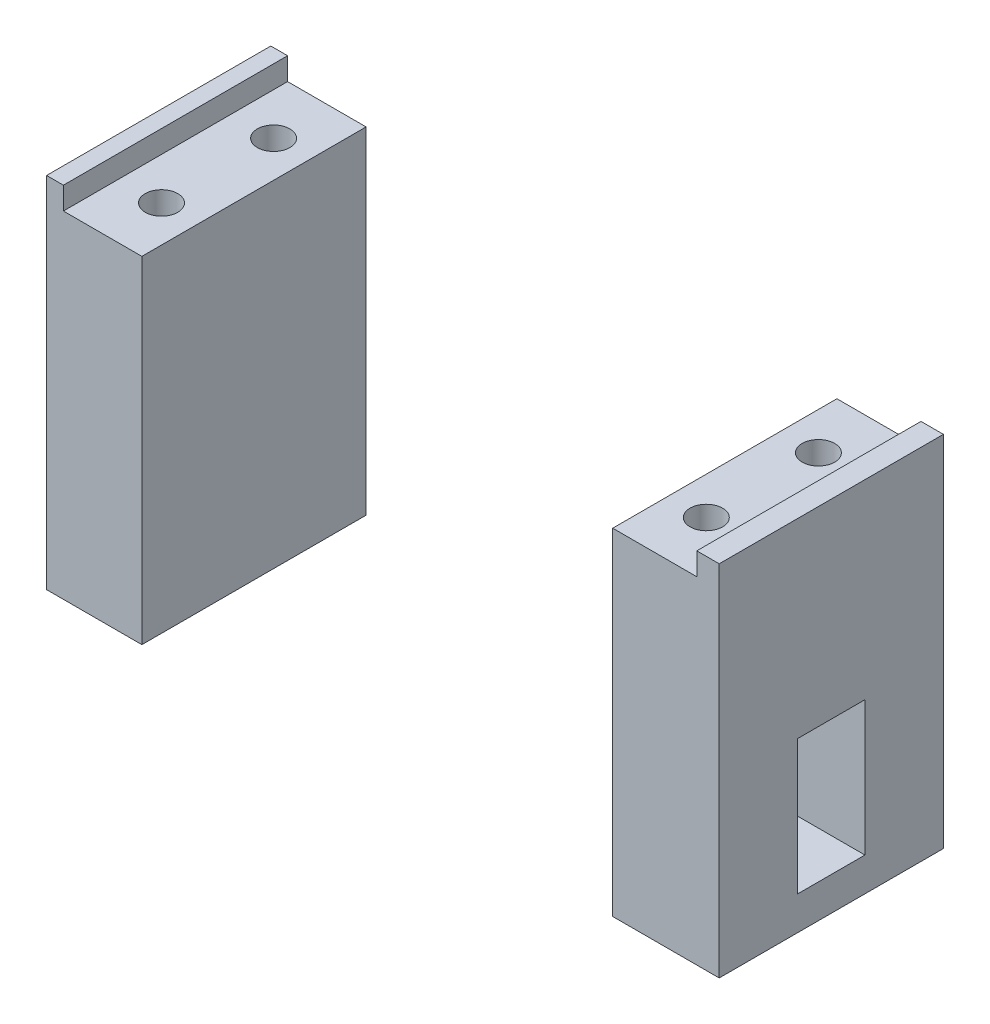
ISO-10303-21;
HEADER;
FILE_DESCRIPTION(('STEP AP214'),'2;1');
FILE_NAME('part.step','',(''),(''),'','','');
FILE_SCHEMA(('AUTOMOTIVE_DESIGN { 1 0 10303 214 1 1 1 1 }'));
ENDSEC;
DATA;
#1=APPLICATION_CONTEXT('core data for automotive mechanical design processes');
#2=APPLICATION_PROTOCOL_DEFINITION('international standard','automotive_design',2000,#1);
#3=PRODUCT_CONTEXT('',#1,'mechanical');
#4=PRODUCT('Part','Part','',(#3));
#5=PRODUCT_RELATED_PRODUCT_CATEGORY('part','',(#4));
#6=PRODUCT_DEFINITION_FORMATION('','',#4);
#7=PRODUCT_DEFINITION_CONTEXT('part definition',#1,'design');
#8=PRODUCT_DEFINITION('design','',#6,#7);
#9=PRODUCT_DEFINITION_SHAPE('','',#8);
#10=(LENGTH_UNIT() NAMED_UNIT(*) SI_UNIT(.MILLI.,.METRE.));
#11=(NAMED_UNIT(*) PLANE_ANGLE_UNIT() SI_UNIT($,.RADIAN.));
#12=(NAMED_UNIT(*) SI_UNIT($,.STERADIAN.) SOLID_ANGLE_UNIT());
#13=UNCERTAINTY_MEASURE_WITH_UNIT(LENGTH_MEASURE(1.E-05),#10,'distance_accuracy_value','');
#14=(GEOMETRIC_REPRESENTATION_CONTEXT(3) GLOBAL_UNCERTAINTY_ASSIGNED_CONTEXT((#13)) GLOBAL_UNIT_ASSIGNED_CONTEXT((#10,
#11,#12)) REPRESENTATION_CONTEXT('',''));
#15=CARTESIAN_POINT('',(0.,0.,0.));
#16=DIRECTION('',(0.,0.,1.));
#17=DIRECTION('',(1.,0.,0.));
#18=AXIS2_PLACEMENT_3D('',#15,#16,#17);
#19=CARTESIAN_POINT('',(0.,30.,0.));
#20=DIRECTION('',(0.,-1.,0.));
#21=DIRECTION('',(0.,0.,-1.));
#22=AXIS2_PLACEMENT_3D('',#19,#20,#21);
#23=PLANE('',#22);
#24=CARTESIAN_POINT('',(13.85,30.,-5.));
#25=DIRECTION('',(0.,1.,0.));
#26=DIRECTION('',(0.,0.,1.));
#27=AXIS2_PLACEMENT_3D('',#24,#25,#26);
#28=CIRCLE('',#27,1.45);
#29=CARTESIAN_POINT('',(13.85,30.,-3.55));
#30=VERTEX_POINT('',#29);
#31=EDGE_CURVE('E180',#30,#30,#28,.T.);
#32=ORIENTED_EDGE('',*,*,#31,.F.);
#33=EDGE_LOOP('',(#32));
#34=FACE_BOUND('',#33,.T.);
#35=CARTESIAN_POINT('',(13.85,30.,5.));
#36=DIRECTION('',(0.,1.,0.));
#37=DIRECTION('',(0.,0.,1.));
#38=AXIS2_PLACEMENT_3D('',#35,#36,#37);
#39=CIRCLE('',#38,1.45);
#40=CARTESIAN_POINT('',(13.85,30.,6.45));
#41=VERTEX_POINT('',#40);
#42=EDGE_CURVE('E190',#41,#41,#39,.T.);
#43=ORIENTED_EDGE('',*,*,#42,.F.);
#44=EDGE_LOOP('',(#43));
#45=FACE_BOUND('',#44,.T.);
#46=DIRECTION('',(0.,0.,1.));
#47=VECTOR('',#46,1.);
#48=CARTESIAN_POINT('',(17.9999999999818,30.,-9.99999999999091));
#49=LINE('',#48,#47);
#50=CARTESIAN_POINT('',(17.9999999999723,30.,-9.99999999999091));
#51=VERTEX_POINT('',#50);
#52=CARTESIAN_POINT('',(17.9999999999818,30.,9.99999999998241));
#53=VERTEX_POINT('',#52);
#54=EDGE_CURVE('E198',#51,#53,#49,.T.);
#55=ORIENTED_EDGE('',*,*,#54,.F.);
#56=DIRECTION('',(1.,0.,0.));
#57=VECTOR('',#56,1.);
#58=CARTESIAN_POINT('',(-400010.,30.,-9.99999999999091));
#59=LINE('',#58,#57);
#60=CARTESIAN_POINT('',(10.4999999999791,30.,-9.99999999999091));
#61=VERTEX_POINT('',#60);
#62=EDGE_CURVE('E248',#61,#51,#59,.T.);
#63=ORIENTED_EDGE('',*,*,#62,.F.);
#64=DIRECTION('',(0.,0.,-1.));
#65=VECTOR('',#64,1.);
#66=CARTESIAN_POINT('',(10.4999999999791,30.,291589.));
#67=LINE('',#66,#65);
#68=CARTESIAN_POINT('',(10.4999999999791,30.,9.99999999998239));
#69=VERTEX_POINT('',#68);
#70=EDGE_CURVE('E233',#69,#61,#67,.T.);
#71=ORIENTED_EDGE('',*,*,#70,.F.);
#72=DIRECTION('',(-1.,0.,0.));
#73=VECTOR('',#72,1.);
#74=CARTESIAN_POINT('',(-400009.999999999,30.,9.99999999925194));
#75=LINE('',#74,#73);
#76=EDGE_CURVE('E224',#53,#69,#75,.T.);
#77=ORIENTED_EDGE('',*,*,#76,.F.);
#78=EDGE_LOOP('',(#55,#63,#71,#77));
#79=FACE_BOUND('',#78,.T.);
#80=ADVANCED_FACE('F59',(#34,#45,#79),#23,.F.);
#81=CARTESIAN_POINT('',(10.4999999999791,30.,291589.));
#82=DIRECTION('',(-1.,0.,0.));
#83=DIRECTION('',(0.,0.,1.));
#84=AXIS2_PLACEMENT_3D('',#81,#82,#83);
#85=PLANE('',#84);
#86=DIRECTION('',(0.,1.,0.));
#87=VECTOR('',#86,1.);
#88=CARTESIAN_POINT('',(10.4999999999791,15.,-4.50000000000728));
#89=LINE('',#88,#87);
#90=CARTESIAN_POINT('',(10.4999999999791,3.,-4.50000000000728));
#91=VERTEX_POINT('',#90);
#92=CARTESIAN_POINT('',(10.4999999999791,15.,-4.50000000000728));
#93=VERTEX_POINT('',#92);
#94=EDGE_CURVE('E254',#91,#93,#89,.T.);
#95=ORIENTED_EDGE('',*,*,#94,.T.);
#96=DIRECTION('',(0.,0.,1.));
#97=VECTOR('',#96,1.);
#98=CARTESIAN_POINT('',(10.4999999999791,15.,3.));
#99=LINE('',#98,#97);
#100=CARTESIAN_POINT('',(10.4999999999791,15.,4.50000000000727));
#101=VERTEX_POINT('',#100);
#102=EDGE_CURVE('E170',#93,#101,#99,.T.);
#103=ORIENTED_EDGE('',*,*,#102,.T.);
#104=DIRECTION('',(0.,-1.,0.));
#105=VECTOR('',#104,1.);
#106=CARTESIAN_POINT('',(10.4999999999791,3.,4.50000000000727));
#107=LINE('',#106,#105);
#108=CARTESIAN_POINT('',(10.4999999999791,3.,4.50000000000727));
#109=VERTEX_POINT('',#108);
#110=EDGE_CURVE('E242',#101,#109,#107,.T.);
#111=ORIENTED_EDGE('',*,*,#110,.T.);
#112=DIRECTION('',(0.,0.,-1.));
#113=VECTOR('',#112,1.);
#114=CARTESIAN_POINT('',(10.4999999999791,3.,3.));
#115=LINE('',#114,#113);
#116=EDGE_CURVE('E152',#109,#91,#115,.T.);
#117=ORIENTED_EDGE('',*,*,#116,.T.);
#118=EDGE_LOOP('',(#95,#103,#111,#117));
#119=FACE_BOUND('',#118,.T.);
#120=DIRECTION('',(0.,0.,-1.));
#121=VECTOR('',#120,1.);
#122=CARTESIAN_POINT('',(10.4999999999791,0.,291589.));
#123=LINE('',#122,#121);
#124=CARTESIAN_POINT('',(10.4999999999791,0.,9.99999999998239));
#125=VERTEX_POINT('',#124);
#126=CARTESIAN_POINT('',(10.4999999999791,0.,-9.99999999999091));
#127=VERTEX_POINT('',#126);
#128=EDGE_CURVE('E241',#125,#127,#123,.T.);
#129=ORIENTED_EDGE('',*,*,#128,.F.);
#130=DIRECTION('',(0.,-1.,0.));
#131=VECTOR('',#130,1.);
#132=CARTESIAN_POINT('',(10.4999999999791,30.,9.99999999998239));
#133=LINE('',#132,#131);
#134=EDGE_CURVE('E211',#69,#125,#133,.T.);
#135=ORIENTED_EDGE('',*,*,#134,.F.);
#136=ORIENTED_EDGE('',*,*,#70,.T.);
#137=DIRECTION('',(0.,-1.,0.));
#138=VECTOR('',#137,1.);
#139=CARTESIAN_POINT('',(10.4999999999791,30.,-9.99999999999091));
#140=LINE('',#139,#138);
#141=EDGE_CURVE('E221',#61,#127,#140,.T.);
#142=ORIENTED_EDGE('',*,*,#141,.T.);
#143=EDGE_LOOP('',(#129,#135,#136,#142));
#144=FACE_BOUND('',#143,.T.);
#145=ADVANCED_FACE('F269',(#119,#144),#85,.T.);
#146=CARTESIAN_POINT('',(-400009.999999999,30.,9.99999999925194));
#147=DIRECTION('',(0.,0.,1.));
#148=DIRECTION('',(1.,0.,0.));
#149=AXIS2_PLACEMENT_3D('',#146,#147,#148);
#150=PLANE('',#149);
#151=DIRECTION('',(-1.,0.,0.));
#152=VECTOR('',#151,1.);
#153=CARTESIAN_POINT('',(-400009.999999999,0.,9.99999999925194));
#154=LINE('',#153,#152);
#155=CARTESIAN_POINT('',(19.9999999999818,0.,9.99999999998241));
#156=VERTEX_POINT('',#155);
#157=EDGE_CURVE('E232',#156,#125,#154,.T.);
#158=ORIENTED_EDGE('',*,*,#157,.F.);
#159=DIRECTION('',(0.,-1.,0.));
#160=VECTOR('',#159,1.);
#161=CARTESIAN_POINT('',(19.9999999999818,30.,9.99999999998241));
#162=LINE('',#161,#160);
#163=CARTESIAN_POINT('',(19.9999999999818,32.,9.9999999999824));
#164=VERTEX_POINT('',#163);
#165=EDGE_CURVE('E229',#164,#156,#162,.T.);
#166=ORIENTED_EDGE('',*,*,#165,.F.);
#167=DIRECTION('',(1.,0.,0.));
#168=VECTOR('',#167,1.);
#169=CARTESIAN_POINT('',(19.9999999999818,32.,9.9999999999824));
#170=LINE('',#169,#168);
#171=CARTESIAN_POINT('',(17.9999999999818,32.,9.99999999998241));
#172=VERTEX_POINT('',#171);
#173=EDGE_CURVE('E200',#172,#164,#170,.T.);
#174=ORIENTED_EDGE('',*,*,#173,.F.);
#175=DIRECTION('',(0.,-1.,0.));
#176=VECTOR('',#175,1.);
#177=CARTESIAN_POINT('',(17.9999999999818,32.,9.99999999998241));
#178=LINE('',#177,#176);
#179=EDGE_CURVE('E192',#172,#53,#178,.T.);
#180=ORIENTED_EDGE('',*,*,#179,.T.);
#181=ORIENTED_EDGE('',*,*,#76,.T.);
#182=ORIENTED_EDGE('',*,*,#134,.T.);
#183=EDGE_LOOP('',(#158,#166,#174,#180,#181,#182));
#184=FACE_BOUND('',#183,.T.);
#185=ADVANCED_FACE('F294',(#184),#150,.T.);
#186=CARTESIAN_POINT('',(19.9999999999818,30.,291589.));
#187=DIRECTION('',(1.,0.,0.));
#188=DIRECTION('',(0.,0.,-1.));
#189=AXIS2_PLACEMENT_3D('',#186,#187,#188);
#190=PLANE('',#189);
#191=DIRECTION('',(0.,0.,1.));
#192=VECTOR('',#191,1.);
#193=CARTESIAN_POINT('',(19.9999999999818,15.,3.));
#194=LINE('',#193,#192);
#195=CARTESIAN_POINT('',(19.9999999999818,15.,-3.));
#196=VERTEX_POINT('',#195);
#197=CARTESIAN_POINT('',(19.9999999999818,15.,3.));
#198=VERTEX_POINT('',#197);
#199=EDGE_CURVE('E162',#196,#198,#194,.T.);
#200=ORIENTED_EDGE('',*,*,#199,.F.);
#201=DIRECTION('',(0.,1.,0.));
#202=VECTOR('',#201,1.);
#203=CARTESIAN_POINT('',(19.9999999999818,15.,-3.));
#204=LINE('',#203,#202);
#205=CARTESIAN_POINT('',(19.9999999999818,3.,-2.99999999998591));
#206=VERTEX_POINT('',#205);
#207=EDGE_CURVE('E166',#206,#196,#204,.T.);
#208=ORIENTED_EDGE('',*,*,#207,.F.);
#209=DIRECTION('',(0.,0.,-1.));
#210=VECTOR('',#209,1.);
#211=CARTESIAN_POINT('',(19.9999999999818,3.,3.));
#212=LINE('',#211,#210);
#213=CARTESIAN_POINT('',(19.9999999999818,3.,3.));
#214=VERTEX_POINT('',#213);
#215=EDGE_CURVE('E149',#214,#206,#212,.T.);
#216=ORIENTED_EDGE('',*,*,#215,.F.);
#217=DIRECTION('',(0.,-1.,0.));
#218=VECTOR('',#217,1.);
#219=CARTESIAN_POINT('',(19.9999999999818,15.,3.));
#220=LINE('',#219,#218);
#221=EDGE_CURVE('E157',#198,#214,#220,.T.);
#222=ORIENTED_EDGE('',*,*,#221,.F.);
#223=EDGE_LOOP('',(#200,#208,#216,#222));
#224=FACE_BOUND('',#223,.T.);
#225=DIRECTION('',(0.,0.,1.));
#226=VECTOR('',#225,1.);
#227=CARTESIAN_POINT('',(19.9999999999818,0.,291589.));
#228=LINE('',#227,#226);
#229=CARTESIAN_POINT('',(19.9999999999818,0.,-9.99999999999091));
#230=VERTEX_POINT('',#229);
#231=EDGE_CURVE('E234',#230,#156,#228,.T.);
#232=ORIENTED_EDGE('',*,*,#231,.F.);
#233=DIRECTION('',(0.,-1.,0.));
#234=VECTOR('',#233,1.);
#235=CARTESIAN_POINT('',(19.9999999999818,30.,-9.99999999999091));
#236=LINE('',#235,#234);
#237=CARTESIAN_POINT('',(19.9999999999818,32.,-9.99999999999091));
#238=VERTEX_POINT('',#237);
#239=EDGE_CURVE('E226',#238,#230,#236,.T.);
#240=ORIENTED_EDGE('',*,*,#239,.F.);
#241=DIRECTION('',(0.,0.,-1.));
#242=VECTOR('',#241,1.);
#243=CARTESIAN_POINT('',(19.9999999999818,32.,-9.99999999999091));
#244=LINE('',#243,#242);
#245=EDGE_CURVE('E205',#164,#238,#244,.T.);
#246=ORIENTED_EDGE('',*,*,#245,.F.);
#247=ORIENTED_EDGE('',*,*,#165,.T.);
#248=EDGE_LOOP('',(#232,#240,#246,#247));
#249=FACE_BOUND('',#248,.T.);
#250=ADVANCED_FACE('F164',(#224,#249),#190,.T.);
#251=CARTESIAN_POINT('',(-400010.,30.,-9.99999999999091));
#252=DIRECTION('',(0.,0.,-1.));
#253=DIRECTION('',(-1.,0.,0.));
#254=AXIS2_PLACEMENT_3D('',#251,#252,#253);
#255=PLANE('',#254);
#256=DIRECTION('',(1.,0.,0.));
#257=VECTOR('',#256,1.);
#258=CARTESIAN_POINT('',(-400010.,0.,-9.99999999999091));
#259=LINE('',#258,#257);
#260=EDGE_CURVE('E239',#127,#230,#259,.T.);
#261=ORIENTED_EDGE('',*,*,#260,.F.);
#262=ORIENTED_EDGE('',*,*,#141,.F.);
#263=ORIENTED_EDGE('',*,*,#62,.T.);
#264=DIRECTION('',(0.,-1.,0.));
#265=VECTOR('',#264,1.);
#266=CARTESIAN_POINT('',(17.9999999999818,32.,-9.99999999999091));
#267=LINE('',#266,#265);
#268=CARTESIAN_POINT('',(17.9999999999818,32.,-9.99999999999091));
#269=VERTEX_POINT('',#268);
#270=EDGE_CURVE('E181',#269,#51,#267,.T.);
#271=ORIENTED_EDGE('',*,*,#270,.F.);
#272=DIRECTION('',(-1.,0.,0.));
#273=VECTOR('',#272,1.);
#274=CARTESIAN_POINT('',(19.9999999999818,32.,-9.99999999999091));
#275=LINE('',#274,#273);
#276=EDGE_CURVE('E210',#238,#269,#275,.T.);
#277=ORIENTED_EDGE('',*,*,#276,.F.);
#278=ORIENTED_EDGE('',*,*,#239,.T.);
#279=EDGE_LOOP('',(#261,#262,#263,#271,#277,#278));
#280=FACE_BOUND('',#279,.T.);
#281=ADVANCED_FACE('F309',(#280),#255,.T.);
#282=CARTESIAN_POINT('',(0.,0.,0.));
#283=DIRECTION('',(0.,-1.,0.));
#284=DIRECTION('',(0.,0.,-1.));
#285=AXIS2_PLACEMENT_3D('',#282,#283,#284);
#286=PLANE('',#285);
#287=CARTESIAN_POINT('',(15.,0.,5.));
#288=DIRECTION('',(0.,-1.,0.));
#289=DIRECTION('',(0.,0.,-1.));
#290=AXIS2_PLACEMENT_3D('',#287,#288,#289);
#291=CIRCLE('',#290,1.45);
#292=CARTESIAN_POINT('',(15.,0.,3.55));
#293=VERTEX_POINT('',#292);
#294=EDGE_CURVE('E213',#293,#293,#291,.T.);
#295=ORIENTED_EDGE('',*,*,#294,.F.);
#296=EDGE_LOOP('',(#295));
#297=FACE_BOUND('',#296,.T.);
#298=CARTESIAN_POINT('',(15.,0.,-5.));
#299=DIRECTION('',(0.,-1.,0.));
#300=DIRECTION('',(0.,0.,-1.));
#301=AXIS2_PLACEMENT_3D('',#298,#299,#300);
#302=CIRCLE('',#301,1.45);
#303=CARTESIAN_POINT('',(15.,0.,-6.45));
#304=VERTEX_POINT('',#303);
#305=EDGE_CURVE('E201',#304,#304,#302,.T.);
#306=ORIENTED_EDGE('',*,*,#305,.F.);
#307=EDGE_LOOP('',(#306));
#308=FACE_BOUND('',#307,.T.);
#309=ORIENTED_EDGE('',*,*,#128,.T.);
#310=ORIENTED_EDGE('',*,*,#260,.T.);
#311=ORIENTED_EDGE('',*,*,#231,.T.);
#312=ORIENTED_EDGE('',*,*,#157,.T.);
#313=EDGE_LOOP('',(#309,#310,#311,#312));
#314=FACE_BOUND('',#313,.T.);
#315=ADVANCED_FACE('F299',(#297,#308,#314),#286,.T.);
#316=CARTESIAN_POINT('',(15.,12.,-5.));
#317=DIRECTION('',(0.,-1.,0.));
#318=DIRECTION('',(0.,0.,-1.));
#319=AXIS2_PLACEMENT_3D('',#316,#317,#318);
#320=CYLINDRICAL_SURFACE('',#319,1.45);
#321=CARTESIAN_POINT('',(15.,12.,-5.));
#322=DIRECTION('',(0.,-1.,0.));
#323=DIRECTION('',(0.,0.,-1.));
#324=AXIS2_PLACEMENT_3D('',#321,#322,#323);
#325=CIRCLE('',#324,1.45);
#326=CARTESIAN_POINT('',(15.,12.,-6.45));
#327=VERTEX_POINT('',#326);
#328=EDGE_CURVE('E218',#327,#327,#325,.T.);
#329=ORIENTED_EDGE('',*,*,#328,.F.);
#330=EDGE_LOOP('',(#329));
#331=FACE_BOUND('',#330,.T.);
#332=ORIENTED_EDGE('',*,*,#305,.T.);
#333=EDGE_LOOP('',(#332));
#334=FACE_BOUND('',#333,.T.);
#335=ADVANCED_FACE('F306',(#331,#334),#320,.F.);
#336=CARTESIAN_POINT('',(15.,12.,-5.));
#337=DIRECTION('',(0.,-1.,0.));
#338=DIRECTION('',(0.,0.,-1.));
#339=AXIS2_PLACEMENT_3D('',#336,#337,#338);
#340=PLANE('',#339);
#341=ORIENTED_EDGE('',*,*,#328,.T.);
#342=EDGE_LOOP('',(#341));
#343=FACE_BOUND('',#342,.T.);
#344=ADVANCED_FACE('F323',(#343),#340,.T.);
#345=CARTESIAN_POINT('',(15.,12.,5.));
#346=DIRECTION('',(0.,-1.,0.));
#347=DIRECTION('',(0.,0.,-1.));
#348=AXIS2_PLACEMENT_3D('',#345,#346,#347);
#349=CYLINDRICAL_SURFACE('',#348,1.45);
#350=CARTESIAN_POINT('',(15.,12.,5.));
#351=DIRECTION('',(0.,-1.,0.));
#352=DIRECTION('',(0.,0.,-1.));
#353=AXIS2_PLACEMENT_3D('',#350,#351,#352);
#354=CIRCLE('',#353,1.45);
#355=CARTESIAN_POINT('',(15.,12.,3.55));
#356=VERTEX_POINT('',#355);
#357=EDGE_CURVE('E212',#356,#356,#354,.T.);
#358=ORIENTED_EDGE('',*,*,#357,.F.);
#359=EDGE_LOOP('',(#358));
#360=FACE_BOUND('',#359,.T.);
#361=ORIENTED_EDGE('',*,*,#294,.T.);
#362=EDGE_LOOP('',(#361));
#363=FACE_BOUND('',#362,.T.);
#364=ADVANCED_FACE('F324',(#360,#363),#349,.F.);
#365=CARTESIAN_POINT('',(15.,12.,5.));
#366=DIRECTION('',(0.,-1.,0.));
#367=DIRECTION('',(0.,0.,-1.));
#368=AXIS2_PLACEMENT_3D('',#365,#366,#367);
#369=PLANE('',#368);
#370=ORIENTED_EDGE('',*,*,#357,.T.);
#371=EDGE_LOOP('',(#370));
#372=FACE_BOUND('',#371,.T.);
#373=ADVANCED_FACE('F328',(#372),#369,.T.);
#374=CARTESIAN_POINT('',(17.9999999999818,32.,-9.99999999999091));
#375=DIRECTION('',(1.,0.,0.));
#376=DIRECTION('',(0.,0.,-1.));
#377=AXIS2_PLACEMENT_3D('',#374,#375,#376);
#378=PLANE('',#377);
#379=ORIENTED_EDGE('',*,*,#54,.T.);
#380=ORIENTED_EDGE('',*,*,#179,.F.);
#381=DIRECTION('',(0.,0.,1.));
#382=VECTOR('',#381,1.);
#383=CARTESIAN_POINT('',(17.9999999999818,32.,-9.99999999999091));
#384=LINE('',#383,#382);
#385=EDGE_CURVE('E204',#269,#172,#384,.T.);
#386=ORIENTED_EDGE('',*,*,#385,.F.);
#387=ORIENTED_EDGE('',*,*,#270,.T.);
#388=EDGE_LOOP('',(#379,#380,#386,#387));
#389=FACE_BOUND('',#388,.T.);
#390=ADVANCED_FACE('F331',(#389),#378,.F.);
#391=CARTESIAN_POINT('',(0.,32.,0.));
#392=DIRECTION('',(0.,-1.,0.));
#393=DIRECTION('',(0.,0.,-1.));
#394=AXIS2_PLACEMENT_3D('',#391,#392,#393);
#395=PLANE('',#394);
#396=ORIENTED_EDGE('',*,*,#245,.T.);
#397=ORIENTED_EDGE('',*,*,#276,.T.);
#398=ORIENTED_EDGE('',*,*,#385,.T.);
#399=ORIENTED_EDGE('',*,*,#173,.T.);
#400=EDGE_LOOP('',(#396,#397,#398,#399));
#401=FACE_BOUND('',#400,.T.);
#402=ADVANCED_FACE('F334',(#401),#395,.F.);
#403=CARTESIAN_POINT('',(13.85,18.,5.));
#404=DIRECTION('',(0.,1.,0.));
#405=DIRECTION('',(0.,0.,1.));
#406=AXIS2_PLACEMENT_3D('',#403,#404,#405);
#407=CYLINDRICAL_SURFACE('',#406,1.45);
#408=CARTESIAN_POINT('',(13.85,18.,5.));
#409=DIRECTION('',(0.,1.,0.));
#410=DIRECTION('',(0.,0.,1.));
#411=AXIS2_PLACEMENT_3D('',#408,#409,#410);
#412=CIRCLE('',#411,1.45);
#413=CARTESIAN_POINT('',(13.85,18.,6.45));
#414=VERTEX_POINT('',#413);
#415=EDGE_CURVE('E178',#414,#414,#412,.T.);
#416=ORIENTED_EDGE('',*,*,#415,.F.);
#417=EDGE_LOOP('',(#416));
#418=FACE_BOUND('',#417,.T.);
#419=ORIENTED_EDGE('',*,*,#42,.T.);
#420=EDGE_LOOP('',(#419));
#421=FACE_BOUND('',#420,.T.);
#422=ADVANCED_FACE('F340',(#418,#421),#407,.F.);
#423=CARTESIAN_POINT('',(13.85,18.,5.));
#424=DIRECTION('',(0.,1.,0.));
#425=DIRECTION('',(0.,0.,1.));
#426=AXIS2_PLACEMENT_3D('',#423,#424,#425);
#427=PLANE('',#426);
#428=ORIENTED_EDGE('',*,*,#415,.T.);
#429=EDGE_LOOP('',(#428));
#430=FACE_BOUND('',#429,.T.);
#431=ADVANCED_FACE('F345',(#430),#427,.T.);
#432=CARTESIAN_POINT('',(13.85,18.,-5.));
#433=DIRECTION('',(0.,1.,0.));
#434=DIRECTION('',(0.,0.,1.));
#435=AXIS2_PLACEMENT_3D('',#432,#433,#434);
#436=CYLINDRICAL_SURFACE('',#435,1.45);
#437=CARTESIAN_POINT('',(13.85,18.,-5.));
#438=DIRECTION('',(0.,1.,0.));
#439=DIRECTION('',(0.,0.,1.));
#440=AXIS2_PLACEMENT_3D('',#437,#438,#439);
#441=CIRCLE('',#440,1.45);
#442=CARTESIAN_POINT('',(13.85,18.,-3.55));
#443=VERTEX_POINT('',#442);
#444=EDGE_CURVE('E185',#443,#443,#441,.T.);
#445=ORIENTED_EDGE('',*,*,#444,.F.);
#446=EDGE_LOOP('',(#445));
#447=FACE_BOUND('',#446,.T.);
#448=ORIENTED_EDGE('',*,*,#31,.T.);
#449=EDGE_LOOP('',(#448));
#450=FACE_BOUND('',#449,.T.);
#451=ADVANCED_FACE('F344',(#447,#450),#436,.F.);
#452=CARTESIAN_POINT('',(13.85,18.,-5.));
#453=DIRECTION('',(0.,1.,0.));
#454=DIRECTION('',(0.,0.,1.));
#455=AXIS2_PLACEMENT_3D('',#452,#453,#454);
#456=PLANE('',#455);
#457=ORIENTED_EDGE('',*,*,#444,.T.);
#458=EDGE_LOOP('',(#457));
#459=FACE_BOUND('',#458,.T.);
#460=ADVANCED_FACE('F347',(#459),#456,.T.);
#461=CARTESIAN_POINT('',(-2.91640786501966,15.,3.));
#462=DIRECTION('',(0.,1.,0.));
#463=DIRECTION('',(0.,0.,1.));
#464=AXIS2_PLACEMENT_3D('',#461,#462,#463);
#465=PLANE('',#464);
#466=ORIENTED_EDGE('',*,*,#102,.F.);
#467=DIRECTION('',(0.919145030017367,0.,0.39391929858078));
#468=VECTOR('',#467,1.);
#469=CARTESIAN_POINT('',(1.88096576923304,15.,-8.19387181320205));
#470=LINE('',#469,#468);
#471=CARTESIAN_POINT('',(13.9999999999791,15.,-3.));
#472=VERTEX_POINT('',#471);
#473=EDGE_CURVE('E260',#93,#472,#470,.T.);
#474=ORIENTED_EDGE('',*,*,#473,.T.);
#475=DIRECTION('',(1.,0.,0.));
#476=VECTOR('',#475,1.);
#477=CARTESIAN_POINT('',(-2.91640786501966,15.,-3.));
#478=LINE('',#477,#476);
#479=EDGE_CURVE('E174',#472,#196,#478,.T.);
#480=ORIENTED_EDGE('',*,*,#479,.T.);
#481=ORIENTED_EDGE('',*,*,#199,.T.);
#482=DIRECTION('',(1.,0.,0.));
#483=VECTOR('',#482,1.);
#484=CARTESIAN_POINT('',(-2.91640786501966,15.,3.));
#485=LINE('',#484,#483);
#486=CARTESIAN_POINT('',(13.9999999999791,15.,3.));
#487=VERTEX_POINT('',#486);
#488=EDGE_CURVE('E154',#487,#198,#485,.T.);
#489=ORIENTED_EDGE('',*,*,#488,.F.);
#490=DIRECTION('',(-0.919145030017367,0.,0.393919298580779));
#491=VECTOR('',#490,1.);
#492=CARTESIAN_POINT('',(-0.291448023877679,15.,9.12490629596828));
#493=LINE('',#492,#491);
#494=EDGE_CURVE('E12',#487,#101,#493,.T.);
#495=ORIENTED_EDGE('',*,*,#494,.T.);
#496=EDGE_LOOP('',(#466,#474,#480,#481,#489,#495));
#497=FACE_BOUND('',#496,.T.);
#498=ADVANCED_FACE('F276',(#497),#465,.F.);
#499=CARTESIAN_POINT('',(-2.91640786501966,15.,3.));
#500=DIRECTION('',(0.,0.,1.));
#501=DIRECTION('',(0.,-1.,0.));
#502=AXIS2_PLACEMENT_3D('',#499,#500,#501);
#503=PLANE('',#502);
#504=DIRECTION('',(1.,0.,0.));
#505=VECTOR('',#504,1.);
#506=CARTESIAN_POINT('',(-2.91640786501966,3.,3.));
#507=LINE('',#506,#505);
#508=CARTESIAN_POINT('',(13.9999999999791,3.,3.));
#509=VERTEX_POINT('',#508);
#510=EDGE_CURVE('E144',#509,#214,#507,.T.);
#511=ORIENTED_EDGE('',*,*,#510,.F.);
#512=DIRECTION('',(0.,1.,0.));
#513=VECTOR('',#512,1.);
#514=CARTESIAN_POINT('',(13.9999999999791,15.,3.));
#515=LINE('',#514,#513);
#516=EDGE_CURVE('E80',#509,#487,#515,.T.);
#517=ORIENTED_EDGE('',*,*,#516,.T.);
#518=ORIENTED_EDGE('',*,*,#488,.T.);
#519=ORIENTED_EDGE('',*,*,#221,.T.);
#520=EDGE_LOOP('',(#511,#517,#518,#519));
#521=FACE_BOUND('',#520,.T.);
#522=ADVANCED_FACE('F160',(#521),#503,.F.);
#523=CARTESIAN_POINT('',(-2.91640786501966,3.,3.));
#524=DIRECTION('',(0.,-1.,0.));
#525=DIRECTION('',(0.,0.,-1.));
#526=AXIS2_PLACEMENT_3D('',#523,#524,#525);
#527=PLANE('',#526);
#528=ORIENTED_EDGE('',*,*,#116,.F.);
#529=DIRECTION('',(0.919145030017367,0.,-0.393919298580779));
#530=VECTOR('',#529,1.);
#531=CARTESIAN_POINT('',(-0.291448023877679,3.,9.12490629596828));
#532=LINE('',#531,#530);
#533=EDGE_CURVE('E70',#109,#509,#532,.T.);
#534=ORIENTED_EDGE('',*,*,#533,.T.);
#535=ORIENTED_EDGE('',*,*,#510,.T.);
#536=ORIENTED_EDGE('',*,*,#215,.T.);
#537=DIRECTION('',(1.,0.,0.));
#538=VECTOR('',#537,1.);
#539=CARTESIAN_POINT('',(-2.91640786501966,3.,-3.));
#540=LINE('',#539,#538);
#541=CARTESIAN_POINT('',(13.9999999999791,3.,-3.));
#542=VERTEX_POINT('',#541);
#543=EDGE_CURVE('E172',#542,#206,#540,.T.);
#544=ORIENTED_EDGE('',*,*,#543,.F.);
#545=DIRECTION('',(-0.919145030017367,0.,-0.39391929858078));
#546=VECTOR('',#545,1.);
#547=CARTESIAN_POINT('',(1.88096576923304,3.,-8.19387181320205));
#548=LINE('',#547,#546);
#549=EDGE_CURVE('E263',#542,#91,#548,.T.);
#550=ORIENTED_EDGE('',*,*,#549,.T.);
#551=EDGE_LOOP('',(#528,#534,#535,#536,#544,#550));
#552=FACE_BOUND('',#551,.T.);
#553=ADVANCED_FACE('F150',(#552),#527,.F.);
#554=CARTESIAN_POINT('',(-2.91640786501966,15.,-3.));
#555=DIRECTION('',(0.,0.,-1.));
#556=DIRECTION('',(0.,1.,0.));
#557=AXIS2_PLACEMENT_3D('',#554,#555,#556);
#558=PLANE('',#557);
#559=ORIENTED_EDGE('',*,*,#479,.F.);
#560=DIRECTION('',(0.,-1.,0.));
#561=VECTOR('',#560,1.);
#562=CARTESIAN_POINT('',(13.9999999999791,3.,-3.));
#563=LINE('',#562,#561);
#564=EDGE_CURVE('E258',#472,#542,#563,.T.);
#565=ORIENTED_EDGE('',*,*,#564,.T.);
#566=ORIENTED_EDGE('',*,*,#543,.T.);
#567=ORIENTED_EDGE('',*,*,#207,.T.);
#568=EDGE_LOOP('',(#559,#565,#566,#567));
#569=FACE_BOUND('',#568,.T.);
#570=ADVANCED_FACE('F278',(#569),#558,.F.);
#571=CARTESIAN_POINT('',(10.4999999999791,30.0000000000316,-4.50000000000728));
#572=DIRECTION('',(-0.39391929858078,0.,0.919145030017367));
#573=DIRECTION('',(0.,-1.,0.));
#574=AXIS2_PLACEMENT_3D('',#571,#572,#573);
#575=PLANE('',#574);
#576=ORIENTED_EDGE('',*,*,#549,.F.);
#577=ORIENTED_EDGE('',*,*,#564,.F.);
#578=ORIENTED_EDGE('',*,*,#473,.F.);
#579=ORIENTED_EDGE('',*,*,#94,.F.);
#580=EDGE_LOOP('',(#576,#577,#578,#579));
#581=FACE_BOUND('',#580,.T.);
#582=ADVANCED_FACE('F268',(#581),#575,.T.);
#583=CARTESIAN_POINT('',(10.4999999999791,30.0000000000316,4.50000000000728));
#584=DIRECTION('',(-0.393919298580779,0.,-0.919145030017367));
#585=DIRECTION('',(0.,1.,0.));
#586=AXIS2_PLACEMENT_3D('',#583,#584,#585);
#587=PLANE('',#586);
#588=ORIENTED_EDGE('',*,*,#494,.F.);
#589=ORIENTED_EDGE('',*,*,#516,.F.);
#590=ORIENTED_EDGE('',*,*,#533,.F.);
#591=ORIENTED_EDGE('',*,*,#110,.F.);
#592=EDGE_LOOP('',(#588,#589,#590,#591));
#593=FACE_BOUND('',#592,.T.);
#594=ADVANCED_FACE('F62',(#593),#587,.T.);
#595=CLOSED_SHELL('',(#80,#145,#185,#250,#281,#315,#335,#344,#364,#373,#390,#402,#422,#431,#451,
#460,#498,#522,#553,#570,#582,#594));
#596=MANIFOLD_SOLID_BREP('B2',#595);
#597=CARTESIAN_POINT('',(0.,30.,0.));
#598=DIRECTION('',(0.,-1.,0.));
#599=DIRECTION('',(0.,0.,-1.));
#600=AXIS2_PLACEMENT_3D('',#597,#598,#599);
#601=PLANE('',#600);
#602=CARTESIAN_POINT('',(-34.75,30.,-5.));
#603=DIRECTION('',(0.,1.,0.));
#604=DIRECTION('',(0.,0.,1.));
#605=AXIS2_PLACEMENT_3D('',#602,#603,#604);
#606=CIRCLE('',#605,1.45);
#607=CARTESIAN_POINT('',(-34.75,30.,-3.55));
#608=VERTEX_POINT('',#607);
#609=EDGE_CURVE('E694',#608,#608,#606,.T.);
#610=ORIENTED_EDGE('',*,*,#609,.F.);
#611=EDGE_LOOP('',(#610));
#612=FACE_BOUND('',#611,.T.);
#613=CARTESIAN_POINT('',(-34.75,30.,5.));
#614=DIRECTION('',(0.,1.,0.));
#615=DIRECTION('',(0.,0.,1.));
#616=AXIS2_PLACEMENT_3D('',#613,#614,#615);
#617=CIRCLE('',#616,1.45);
#618=CARTESIAN_POINT('',(-34.75,30.,6.45));
#619=VERTEX_POINT('',#618);
#620=EDGE_CURVE('E696',#619,#619,#617,.T.);
#621=ORIENTED_EDGE('',*,*,#620,.F.);
#622=EDGE_LOOP('',(#621));
#623=FACE_BOUND('',#622,.T.);
#624=DIRECTION('',(0.,0.,-1.));
#625=VECTOR('',#624,1.);
#626=CARTESIAN_POINT('',(-38.5000000000205,30.,-9.99999999999683));
#627=LINE('',#626,#625);
#628=CARTESIAN_POINT('',(-38.4999999999991,30.,10.0000000000055));
#629=VERTEX_POINT('',#628);
#630=CARTESIAN_POINT('',(-38.5000000000205,30.,-9.99999999999683));
#631=VERTEX_POINT('',#630);
#632=EDGE_CURVE('E543',#629,#631,#627,.T.);
#633=ORIENTED_EDGE('',*,*,#632,.F.);
#634=DIRECTION('',(-1.,0.,0.));
#635=VECTOR('',#634,1.);
#636=CARTESIAN_POINT('',(-400010.,30.,10.000000000332));
#637=LINE('',#636,#635);
#638=CARTESIAN_POINT('',(-31.4999999999941,30.,10.0000000000054));
#639=VERTEX_POINT('',#638);
#640=EDGE_CURVE('E586',#639,#629,#637,.T.);
#641=ORIENTED_EDGE('',*,*,#640,.F.);
#642=DIRECTION('',(0.,0.,1.));
#643=VECTOR('',#642,1.);
#644=CARTESIAN_POINT('',(-31.4999999999941,30.,291589.));
#645=LINE('',#644,#643);
#646=CARTESIAN_POINT('',(-31.4999999999941,30.,-9.99999999999685));
#647=VERTEX_POINT('',#646);
#648=EDGE_CURVE('E590',#647,#639,#645,.T.);
#649=ORIENTED_EDGE('',*,*,#648,.F.);
#650=DIRECTION('',(1.,0.,0.));
#651=VECTOR('',#650,1.);
#652=CARTESIAN_POINT('',(-400010.000000001,30.,-9.99999999885404));
#653=LINE('',#652,#651);
#654=EDGE_CURVE('E549',#631,#647,#653,.T.);
#655=ORIENTED_EDGE('',*,*,#654,.F.);
#656=EDGE_LOOP('',(#633,#641,#649,#655));
#657=FACE_BOUND('',#656,.T.);
#658=ADVANCED_FACE('F526',(#612,#623,#657),#601,.F.);
#659=CARTESIAN_POINT('',(-31.4999999999941,30.,291589.));
#660=DIRECTION('',(1.,0.,0.));
#661=DIRECTION('',(0.,0.,-1.));
#662=AXIS2_PLACEMENT_3D('',#659,#660,#661);
#663=PLANE('',#662);
#664=DIRECTION('',(0.,0.,1.));
#665=VECTOR('',#664,1.);
#666=CARTESIAN_POINT('',(-31.4999999999941,0.,291589.));
#667=LINE('',#666,#665);
#668=CARTESIAN_POINT('',(-31.4999999999941,0.,-9.99999999999685));
#669=VERTEX_POINT('',#668);
#670=CARTESIAN_POINT('',(-31.4999999999941,0.,10.0000000000054));
#671=VERTEX_POINT('',#670);
#672=EDGE_CURVE('E576',#669,#671,#667,.T.);
#673=ORIENTED_EDGE('',*,*,#672,.F.);
#674=DIRECTION('',(0.,-1.,0.));
#675=VECTOR('',#674,1.);
#676=CARTESIAN_POINT('',(-31.4999999999941,30.,-9.99999999999685));
#677=LINE('',#676,#675);
#678=EDGE_CURVE('E57',#647,#669,#677,.T.);
#679=ORIENTED_EDGE('',*,*,#678,.F.);
#680=ORIENTED_EDGE('',*,*,#648,.T.);
#681=DIRECTION('',(0.,-1.,0.));
#682=VECTOR('',#681,1.);
#683=CARTESIAN_POINT('',(-31.4999999999941,30.,10.0000000000054));
#684=LINE('',#683,#682);
#685=EDGE_CURVE('E530',#639,#671,#684,.T.);
#686=ORIENTED_EDGE('',*,*,#685,.T.);
#687=EDGE_LOOP('',(#673,#679,#680,#686));
#688=FACE_BOUND('',#687,.T.);
#689=ADVANCED_FACE('F529',(#688),#663,.T.);
#690=CARTESIAN_POINT('',(-400010.000000001,30.,-9.99999999885404));
#691=DIRECTION('',(0.,0.,-1.));
#692=DIRECTION('',(-1.,0.,0.));
#693=AXIS2_PLACEMENT_3D('',#690,#691,#692);
#694=PLANE('',#693);
#695=DIRECTION('',(1.,0.,0.));
#696=VECTOR('',#695,1.);
#697=CARTESIAN_POINT('',(-400010.000000001,0.,-9.99999999885404));
#698=LINE('',#697,#696);
#699=CARTESIAN_POINT('',(-40.0000000000205,0.,-9.99999999999683));
#700=VERTEX_POINT('',#699);
#701=EDGE_CURVE('E571',#700,#669,#698,.T.);
#702=ORIENTED_EDGE('',*,*,#701,.F.);
#703=DIRECTION('',(0.,-1.,0.));
#704=VECTOR('',#703,1.);
#705=CARTESIAN_POINT('',(-40.0000000000205,30.,-9.99999999999683));
#706=LINE('',#705,#704);
#707=CARTESIAN_POINT('',(-40.0000000000205,32.,-9.99999999999683));
#708=VERTEX_POINT('',#707);
#709=EDGE_CURVE('E533',#708,#700,#706,.T.);
#710=ORIENTED_EDGE('',*,*,#709,.F.);
#711=DIRECTION('',(-1.,0.,0.));
#712=VECTOR('',#711,1.);
#713=CARTESIAN_POINT('',(-40.0000000000205,32.,-9.99999999999683));
#714=LINE('',#713,#712);
#715=CARTESIAN_POINT('',(-38.5000000000205,32.,-9.99999999999683));
#716=VERTEX_POINT('',#715);
#717=EDGE_CURVE('E620',#716,#708,#714,.T.);
#718=ORIENTED_EDGE('',*,*,#717,.F.);
#719=DIRECTION('',(0.,-1.,0.));
#720=VECTOR('',#719,1.);
#721=CARTESIAN_POINT('',(-38.5000000000205,32.,-9.99999999999683));
#722=LINE('',#721,#720);
#723=EDGE_CURVE('E608',#716,#631,#722,.T.);
#724=ORIENTED_EDGE('',*,*,#723,.T.);
#725=ORIENTED_EDGE('',*,*,#654,.T.);
#726=ORIENTED_EDGE('',*,*,#678,.T.);
#727=EDGE_LOOP('',(#702,#710,#718,#724,#725,#726));
#728=FACE_BOUND('',#727,.T.);
#729=ADVANCED_FACE('F568',(#728),#694,.T.);
#730=CARTESIAN_POINT('',(-40.0000000000205,30.,291589.));
#731=DIRECTION('',(-1.,0.,0.));
#732=DIRECTION('',(0.,0.,1.));
#733=AXIS2_PLACEMENT_3D('',#730,#731,#732);
#734=PLANE('',#733);
#735=DIRECTION('',(0.,0.,-1.));
#736=VECTOR('',#735,1.);
#737=CARTESIAN_POINT('',(-40.0000000000205,0.,291589.));
#738=LINE('',#737,#736);
#739=CARTESIAN_POINT('',(-40.0000000000205,0.,9.99999999999091));
#740=VERTEX_POINT('',#739);
#741=EDGE_CURVE('E587',#740,#700,#738,.T.);
#742=ORIENTED_EDGE('',*,*,#741,.F.);
#743=DIRECTION('',(0.,-1.,0.));
#744=VECTOR('',#743,1.);
#745=CARTESIAN_POINT('',(-40.0000000000205,30.,9.99999999999091));
#746=LINE('',#745,#744);
#747=CARTESIAN_POINT('',(-40.0000000000205,32.,10.0000000000054));
#748=VERTEX_POINT('',#747);
#749=EDGE_CURVE('E592',#748,#740,#746,.T.);
#750=ORIENTED_EDGE('',*,*,#749,.F.);
#751=DIRECTION('',(0.,0.,1.));
#752=VECTOR('',#751,1.);
#753=CARTESIAN_POINT('',(-40.0000000000205,32.,-9.99999999999683));
#754=LINE('',#753,#752);
#755=EDGE_CURVE('E614',#708,#748,#754,.T.);
#756=ORIENTED_EDGE('',*,*,#755,.F.);
#757=ORIENTED_EDGE('',*,*,#709,.T.);
#758=EDGE_LOOP('',(#742,#750,#756,#757));
#759=FACE_BOUND('',#758,.T.);
#760=ADVANCED_FACE('F647',(#759),#734,.T.);
#761=CARTESIAN_POINT('',(-400010.,30.,10.000000000332));
#762=DIRECTION('',(0.,0.,1.));
#763=DIRECTION('',(1.,0.,0.));
#764=AXIS2_PLACEMENT_3D('',#761,#762,#763);
#765=PLANE('',#764);
#766=DIRECTION('',(-1.,0.,0.));
#767=VECTOR('',#766,1.);
#768=CARTESIAN_POINT('',(-400010.,0.,10.000000000332));
#769=LINE('',#768,#767);
#770=EDGE_CURVE('E579',#671,#740,#769,.T.);
#771=ORIENTED_EDGE('',*,*,#770,.F.);
#772=ORIENTED_EDGE('',*,*,#685,.F.);
#773=ORIENTED_EDGE('',*,*,#640,.T.);
#774=DIRECTION('',(0.,-1.,0.));
#775=VECTOR('',#774,1.);
#776=CARTESIAN_POINT('',(-38.5000000000205,32.,10.0000000000054));
#777=LINE('',#776,#775);
#778=CARTESIAN_POINT('',(-38.5000000000205,32.,10.0000000000054));
#779=VERTEX_POINT('',#778);
#780=EDGE_CURVE('E615',#779,#629,#777,.T.);
#781=ORIENTED_EDGE('',*,*,#780,.F.);
#782=DIRECTION('',(1.,0.,0.));
#783=VECTOR('',#782,1.);
#784=CARTESIAN_POINT('',(-40.0000000000205,32.,10.0000000000054));
#785=LINE('',#784,#783);
#786=EDGE_CURVE('E706',#748,#779,#785,.T.);
#787=ORIENTED_EDGE('',*,*,#786,.F.);
#788=ORIENTED_EDGE('',*,*,#749,.T.);
#789=EDGE_LOOP('',(#771,#772,#773,#781,#787,#788));
#790=FACE_BOUND('',#789,.T.);
#791=ADVANCED_FACE('F599',(#790),#765,.T.);
#792=CARTESIAN_POINT('',(0.,0.,0.));
#793=DIRECTION('',(0.,-1.,0.));
#794=DIRECTION('',(0.,0.,-1.));
#795=AXIS2_PLACEMENT_3D('',#792,#793,#794);
#796=PLANE('',#795);
#797=CARTESIAN_POINT('',(-35.,0.,-5.));
#798=DIRECTION('',(0.,-1.,0.));
#799=DIRECTION('',(0.,0.,-1.));
#800=AXIS2_PLACEMENT_3D('',#797,#798,#799);
#801=CIRCLE('',#800,1.45);
#802=CARTESIAN_POINT('',(-35.,0.,-6.45));
#803=VERTEX_POINT('',#802);
#804=EDGE_CURVE('E617',#803,#803,#801,.T.);
#805=ORIENTED_EDGE('',*,*,#804,.F.);
#806=EDGE_LOOP('',(#805));
#807=FACE_BOUND('',#806,.T.);
#808=CARTESIAN_POINT('',(-35.,0.,5.));
#809=DIRECTION('',(0.,-1.,0.));
#810=DIRECTION('',(0.,0.,-1.));
#811=AXIS2_PLACEMENT_3D('',#808,#809,#810);
#812=CIRCLE('',#811,1.45);
#813=CARTESIAN_POINT('',(-35.,0.,3.55));
#814=VERTEX_POINT('',#813);
#815=EDGE_CURVE('E627',#814,#814,#812,.T.);
#816=ORIENTED_EDGE('',*,*,#815,.F.);
#817=EDGE_LOOP('',(#816));
#818=FACE_BOUND('',#817,.T.);
#819=ORIENTED_EDGE('',*,*,#672,.T.);
#820=ORIENTED_EDGE('',*,*,#770,.T.);
#821=ORIENTED_EDGE('',*,*,#741,.T.);
#822=ORIENTED_EDGE('',*,*,#701,.T.);
#823=EDGE_LOOP('',(#819,#820,#821,#822));
#824=FACE_BOUND('',#823,.T.);
#825=ADVANCED_FACE('F581',(#807,#818,#824),#796,.T.);
#826=CARTESIAN_POINT('',(-35.,12.,5.));
#827=DIRECTION('',(0.,-1.,0.));
#828=DIRECTION('',(0.,0.,-1.));
#829=AXIS2_PLACEMENT_3D('',#826,#827,#828);
#830=CYLINDRICAL_SURFACE('',#829,1.45);
#831=CARTESIAN_POINT('',(-35.,12.,5.));
#832=DIRECTION('',(0.,-1.,0.));
#833=DIRECTION('',(0.,0.,-1.));
#834=AXIS2_PLACEMENT_3D('',#831,#832,#833);
#835=CIRCLE('',#834,1.45);
#836=CARTESIAN_POINT('',(-35.,12.,3.55));
#837=VERTEX_POINT('',#836);
#838=EDGE_CURVE('E582',#837,#837,#835,.T.);
#839=ORIENTED_EDGE('',*,*,#838,.F.);
#840=EDGE_LOOP('',(#839));
#841=FACE_BOUND('',#840,.T.);
#842=ORIENTED_EDGE('',*,*,#815,.T.);
#843=EDGE_LOOP('',(#842));
#844=FACE_BOUND('',#843,.T.);
#845=ADVANCED_FACE('F634',(#841,#844),#830,.F.);
#846=CARTESIAN_POINT('',(-35.,12.,5.));
#847=DIRECTION('',(0.,-1.,0.));
#848=DIRECTION('',(0.,0.,-1.));
#849=AXIS2_PLACEMENT_3D('',#846,#847,#848);
#850=PLANE('',#849);
#851=ORIENTED_EDGE('',*,*,#838,.T.);
#852=EDGE_LOOP('',(#851));
#853=FACE_BOUND('',#852,.T.);
#854=ADVANCED_FACE('F644',(#853),#850,.T.);
#855=CARTESIAN_POINT('',(-35.,12.,-5.));
#856=DIRECTION('',(0.,-1.,0.));
#857=DIRECTION('',(0.,0.,-1.));
#858=AXIS2_PLACEMENT_3D('',#855,#856,#857);
#859=CYLINDRICAL_SURFACE('',#858,1.45);
#860=CARTESIAN_POINT('',(-35.,12.,-5.));
#861=DIRECTION('',(0.,-1.,0.));
#862=DIRECTION('',(0.,0.,-1.));
#863=AXIS2_PLACEMENT_3D('',#860,#861,#862);
#864=CIRCLE('',#863,1.45);
#865=CARTESIAN_POINT('',(-35.,12.,-6.45));
#866=VERTEX_POINT('',#865);
#867=EDGE_CURVE('E622',#866,#866,#864,.T.);
#868=ORIENTED_EDGE('',*,*,#867,.F.);
#869=EDGE_LOOP('',(#868));
#870=FACE_BOUND('',#869,.T.);
#871=ORIENTED_EDGE('',*,*,#804,.T.);
#872=EDGE_LOOP('',(#871));
#873=FACE_BOUND('',#872,.T.);
#874=ADVANCED_FACE('F661',(#870,#873),#859,.F.);
#875=CARTESIAN_POINT('',(-35.,12.,-5.));
#876=DIRECTION('',(0.,-1.,0.));
#877=DIRECTION('',(0.,0.,-1.));
#878=AXIS2_PLACEMENT_3D('',#875,#876,#877);
#879=PLANE('',#878);
#880=ORIENTED_EDGE('',*,*,#867,.T.);
#881=EDGE_LOOP('',(#880));
#882=FACE_BOUND('',#881,.T.);
#883=ADVANCED_FACE('F670',(#882),#879,.T.);
#884=CARTESIAN_POINT('',(-38.5000000000205,32.,-9.99999999999683));
#885=DIRECTION('',(-1.,0.,0.));
#886=DIRECTION('',(0.,0.,1.));
#887=AXIS2_PLACEMENT_3D('',#884,#885,#886);
#888=PLANE('',#887);
#889=ORIENTED_EDGE('',*,*,#632,.T.);
#890=ORIENTED_EDGE('',*,*,#723,.F.);
#891=DIRECTION('',(0.,0.,-1.));
#892=VECTOR('',#891,1.);
#893=CARTESIAN_POINT('',(-38.5000000000205,32.,-9.99999999999683));
#894=LINE('',#893,#892);
#895=EDGE_CURVE('E623',#779,#716,#894,.T.);
#896=ORIENTED_EDGE('',*,*,#895,.F.);
#897=ORIENTED_EDGE('',*,*,#780,.T.);
#898=EDGE_LOOP('',(#889,#890,#896,#897));
#899=FACE_BOUND('',#898,.T.);
#900=ADVANCED_FACE('F610',(#899),#888,.F.);
#901=CARTESIAN_POINT('',(0.,32.,0.));
#902=DIRECTION('',(0.,1.,0.));
#903=DIRECTION('',(0.,0.,1.));
#904=AXIS2_PLACEMENT_3D('',#901,#902,#903);
#905=PLANE('',#904);
#906=ORIENTED_EDGE('',*,*,#755,.T.);
#907=ORIENTED_EDGE('',*,*,#786,.T.);
#908=ORIENTED_EDGE('',*,*,#895,.T.);
#909=ORIENTED_EDGE('',*,*,#717,.T.);
#910=EDGE_LOOP('',(#906,#907,#908,#909));
#911=FACE_BOUND('',#910,.T.);
#912=ADVANCED_FACE('F672',(#911),#905,.T.);
#913=CARTESIAN_POINT('',(-34.75,18.,5.));
#914=DIRECTION('',(0.,1.,0.));
#915=DIRECTION('',(0.,0.,1.));
#916=AXIS2_PLACEMENT_3D('',#913,#914,#915);
#917=CYLINDRICAL_SURFACE('',#916,1.45);
#918=CARTESIAN_POINT('',(-34.75,18.,5.));
#919=DIRECTION('',(0.,1.,0.));
#920=DIRECTION('',(0.,0.,1.));
#921=AXIS2_PLACEMENT_3D('',#918,#919,#920);
#922=CIRCLE('',#921,1.45);
#923=CARTESIAN_POINT('',(-34.75,18.,6.45));
#924=VERTEX_POINT('',#923);
#925=EDGE_CURVE('E704',#924,#924,#922,.T.);
#926=ORIENTED_EDGE('',*,*,#925,.F.);
#927=EDGE_LOOP('',(#926));
#928=FACE_BOUND('',#927,.T.);
#929=ORIENTED_EDGE('',*,*,#620,.T.);
#930=EDGE_LOOP('',(#929));
#931=FACE_BOUND('',#930,.T.);
#932=ADVANCED_FACE('F676',(#928,#931),#917,.F.);
#933=CARTESIAN_POINT('',(-34.75,18.,5.));
#934=DIRECTION('',(0.,1.,0.));
#935=DIRECTION('',(0.,0.,1.));
#936=AXIS2_PLACEMENT_3D('',#933,#934,#935);
#937=PLANE('',#936);
#938=ORIENTED_EDGE('',*,*,#925,.T.);
#939=EDGE_LOOP('',(#938));
#940=FACE_BOUND('',#939,.T.);
#941=ADVANCED_FACE('F679',(#940),#937,.T.);
#942=CARTESIAN_POINT('',(-34.75,18.,-5.));
#943=DIRECTION('',(0.,1.,0.));
#944=DIRECTION('',(0.,0.,1.));
#945=AXIS2_PLACEMENT_3D('',#942,#943,#944);
#946=CYLINDRICAL_SURFACE('',#945,1.45);
#947=CARTESIAN_POINT('',(-34.75,18.,-5.));
#948=DIRECTION('',(0.,1.,0.));
#949=DIRECTION('',(0.,0.,1.));
#950=AXIS2_PLACEMENT_3D('',#947,#948,#949);
#951=CIRCLE('',#950,1.45);
#952=CARTESIAN_POINT('',(-34.75,18.,-3.55));
#953=VERTEX_POINT('',#952);
#954=EDGE_CURVE('E611',#953,#953,#951,.T.);
#955=ORIENTED_EDGE('',*,*,#954,.F.);
#956=EDGE_LOOP('',(#955));
#957=FACE_BOUND('',#956,.T.);
#958=ORIENTED_EDGE('',*,*,#609,.T.);
#959=EDGE_LOOP('',(#958));
#960=FACE_BOUND('',#959,.T.);
#961=ADVANCED_FACE('F682',(#957,#960),#946,.F.);
#962=CARTESIAN_POINT('',(-34.75,18.,-5.));
#963=DIRECTION('',(0.,1.,0.));
#964=DIRECTION('',(0.,0.,1.));
#965=AXIS2_PLACEMENT_3D('',#962,#963,#964);
#966=PLANE('',#965);
#967=ORIENTED_EDGE('',*,*,#954,.T.);
#968=EDGE_LOOP('',(#967));
#969=FACE_BOUND('',#968,.T.);
#970=ADVANCED_FACE('F690',(#969),#966,.T.);
#971=CLOSED_SHELL('',(#658,#689,#729,#760,#791,#825,#845,#854,#874,#883,#900,#912,#932,#941,
#961,#970));
#972=MANIFOLD_SOLID_BREP('B6',#971);
#973=ADVANCED_BREP_SHAPE_REPRESENTATION('',(#18,#596,#972),#14);
#974=SHAPE_DEFINITION_REPRESENTATION(#9,#973);
ENDSEC;
END-ISO-10303-21;
